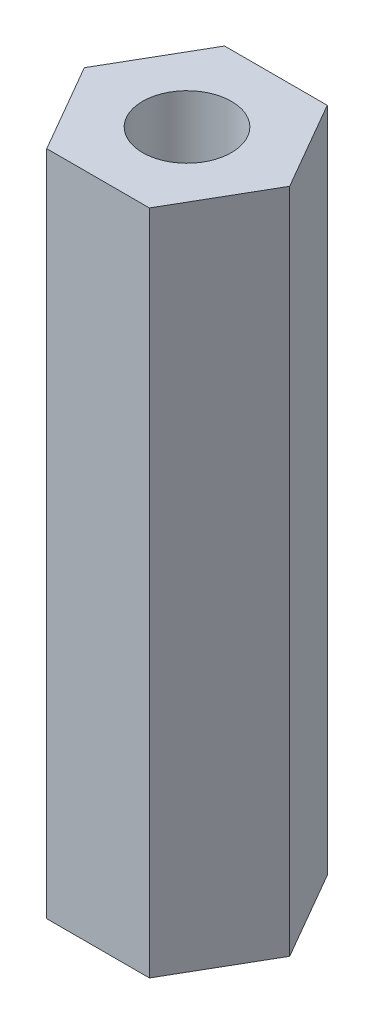
ISO-10303-21;
HEADER;
FILE_DESCRIPTION(('STEP AP214'),'2;1');
FILE_NAME('part.step','',(''),(''),'','','');
FILE_SCHEMA(('AUTOMOTIVE_DESIGN { 1 0 10303 214 1 1 1 1 }'));
ENDSEC;
DATA;
#1=APPLICATION_CONTEXT('core data for automotive mechanical design processes');
#2=APPLICATION_PROTOCOL_DEFINITION('international standard','automotive_design',2000,#1);
#3=PRODUCT_CONTEXT('',#1,'mechanical');
#4=PRODUCT('Part','Part','',(#3));
#5=PRODUCT_RELATED_PRODUCT_CATEGORY('part','',(#4));
#6=PRODUCT_DEFINITION_FORMATION('','',#4);
#7=PRODUCT_DEFINITION_CONTEXT('part definition',#1,'design');
#8=PRODUCT_DEFINITION('design','',#6,#7);
#9=PRODUCT_DEFINITION_SHAPE('','',#8);
#10=(LENGTH_UNIT() NAMED_UNIT(*) SI_UNIT(.MILLI.,.METRE.));
#11=(NAMED_UNIT(*) PLANE_ANGLE_UNIT() SI_UNIT($,.RADIAN.));
#12=(NAMED_UNIT(*) SI_UNIT($,.STERADIAN.) SOLID_ANGLE_UNIT());
#13=UNCERTAINTY_MEASURE_WITH_UNIT(LENGTH_MEASURE(1.E-05),#10,'distance_accuracy_value','');
#14=(GEOMETRIC_REPRESENTATION_CONTEXT(3) GLOBAL_UNCERTAINTY_ASSIGNED_CONTEXT((#13)) GLOBAL_UNIT_ASSIGNED_CONTEXT((#10,
#11,#12)) REPRESENTATION_CONTEXT('',''));
#15=CARTESIAN_POINT('',(0.,0.,0.));
#16=DIRECTION('',(0.,0.,1.));
#17=DIRECTION('',(1.,0.,0.));
#18=AXIS2_PLACEMENT_3D('',#15,#16,#17);
#19=CARTESIAN_POINT('',(0.,0.,0.));
#20=DIRECTION('',(0.,1.,0.));
#21=DIRECTION('',(1.,0.,0.));
#22=AXIS2_PLACEMENT_3D('',#19,#20,#21);
#23=CYLINDRICAL_SURFACE('',#22,1.);
#24=CARTESIAN_POINT('',(0.,0.,0.));
#25=DIRECTION('',(0.,-1.,0.));
#26=DIRECTION('',(1.,0.,0.));
#27=AXIS2_PLACEMENT_3D('',#24,#25,#26);
#28=CIRCLE('',#27,1.);
#29=CARTESIAN_POINT('',(-1.,0.,0.));
#30=VERTEX_POINT('',#29);
#31=EDGE_CURVE('E124',#30,#30,#28,.T.);
#32=ORIENTED_EDGE('',*,*,#31,.T.);
#33=DIRECTION('',(0.,1.,0.));
#34=VECTOR('',#33,1.);
#35=CARTESIAN_POINT('',(-1.,0.,0.));
#36=LINE('',#35,#34);
#37=CARTESIAN_POINT('',(-1.,15.,0.));
#38=VERTEX_POINT('',#37);
#39=EDGE_CURVE('E11',#30,#38,#36,.T.);
#40=ORIENTED_EDGE('',*,*,#39,.T.);
#41=CARTESIAN_POINT('',(0.,15.,0.));
#42=DIRECTION('',(0.,-1.,0.));
#43=DIRECTION('',(1.,0.,0.));
#44=AXIS2_PLACEMENT_3D('',#41,#42,#43);
#45=CIRCLE('',#44,1.);
#46=EDGE_CURVE('E121',#38,#38,#45,.T.);
#47=ORIENTED_EDGE('',*,*,#46,.F.);
#48=ORIENTED_EDGE('',*,*,#39,.F.);
#49=EDGE_LOOP('',(#32,#40,#47,#48));
#50=FACE_BOUND('',#49,.T.);
#51=ADVANCED_FACE('F17',(#50),#23,.F.);
#52=CARTESIAN_POINT('',(1.15470053837925,0.,-2.));
#53=DIRECTION('',(0.,0.,-1.));
#54=DIRECTION('',(-1.,0.,0.));
#55=AXIS2_PLACEMENT_3D('',#52,#53,#54);
#56=PLANE('',#55);
#57=DIRECTION('',(-1.,0.,0.));
#58=VECTOR('',#57,1.);
#59=CARTESIAN_POINT('',(1.15470053837925,0.,-2.));
#60=LINE('',#59,#58);
#61=CARTESIAN_POINT('',(1.15470053837925,0.,-2.));
#62=VERTEX_POINT('',#61);
#63=CARTESIAN_POINT('',(-1.15470053837925,0.,-2.));
#64=VERTEX_POINT('',#63);
#65=EDGE_CURVE('E135',#62,#64,#60,.T.);
#66=ORIENTED_EDGE('',*,*,#65,.T.);
#67=DIRECTION('',(0.,1.,0.));
#68=VECTOR('',#67,1.);
#69=CARTESIAN_POINT('',(-1.15470053837925,0.,-2.));
#70=LINE('',#69,#68);
#71=CARTESIAN_POINT('',(-1.15470053837925,15.,-2.));
#72=VERTEX_POINT('',#71);
#73=EDGE_CURVE('E130',#64,#72,#70,.T.);
#74=ORIENTED_EDGE('',*,*,#73,.T.);
#75=DIRECTION('',(-1.,0.,0.));
#76=VECTOR('',#75,1.);
#77=CARTESIAN_POINT('',(1.15470053837925,15.,-2.));
#78=LINE('',#77,#76);
#79=CARTESIAN_POINT('',(1.15470053837925,15.,-2.));
#80=VERTEX_POINT('',#79);
#81=EDGE_CURVE('E143',#80,#72,#78,.T.);
#82=ORIENTED_EDGE('',*,*,#81,.F.);
#83=DIRECTION('',(0.,1.,0.));
#84=VECTOR('',#83,1.);
#85=CARTESIAN_POINT('',(1.15470053837925,0.,-2.));
#86=LINE('',#85,#84);
#87=EDGE_CURVE('E28',#62,#80,#86,.T.);
#88=ORIENTED_EDGE('',*,*,#87,.F.);
#89=EDGE_LOOP('',(#66,#74,#82,#88));
#90=FACE_BOUND('',#89,.T.);
#91=ADVANCED_FACE('F171',(#90),#56,.T.);
#92=CARTESIAN_POINT('',(2.3094010767585,0.,0.));
#93=DIRECTION('',(0.866025403784438,0.,-0.5));
#94=DIRECTION('',(0.,-1.,0.));
#95=AXIS2_PLACEMENT_3D('',#92,#93,#94);
#96=PLANE('',#95);
#97=DIRECTION('',(-0.5,0.,-0.866025403784439));
#98=VECTOR('',#97,1.);
#99=CARTESIAN_POINT('',(2.3094010767585,0.,0.));
#100=LINE('',#99,#98);
#101=CARTESIAN_POINT('',(2.3094010767585,0.,0.));
#102=VERTEX_POINT('',#101);
#103=EDGE_CURVE('E138',#102,#62,#100,.T.);
#104=ORIENTED_EDGE('',*,*,#103,.T.);
#105=ORIENTED_EDGE('',*,*,#87,.T.);
#106=DIRECTION('',(-0.5,0.,-0.866025403784439));
#107=VECTOR('',#106,1.);
#108=CARTESIAN_POINT('',(2.3094010767585,15.,0.));
#109=LINE('',#108,#107);
#110=CARTESIAN_POINT('',(2.3094010767585,15.,0.));
#111=VERTEX_POINT('',#110);
#112=EDGE_CURVE('E110',#111,#80,#109,.T.);
#113=ORIENTED_EDGE('',*,*,#112,.F.);
#114=DIRECTION('',(0.,1.,0.));
#115=VECTOR('',#114,1.);
#116=CARTESIAN_POINT('',(2.3094010767585,0.,0.));
#117=LINE('',#116,#115);
#118=EDGE_CURVE('E85',#102,#111,#117,.T.);
#119=ORIENTED_EDGE('',*,*,#118,.F.);
#120=EDGE_LOOP('',(#104,#105,#113,#119));
#121=FACE_BOUND('',#120,.T.);
#122=ADVANCED_FACE('F164',(#121),#96,.T.);
#123=CARTESIAN_POINT('',(1.15470053837925,0.,2.));
#124=DIRECTION('',(0.866025403784439,0.,0.5));
#125=DIRECTION('',(0.,-1.,0.));
#126=AXIS2_PLACEMENT_3D('',#123,#124,#125);
#127=PLANE('',#126);
#128=DIRECTION('',(0.5,0.,-0.866025403784439));
#129=VECTOR('',#128,1.);
#130=CARTESIAN_POINT('',(1.15470053837925,0.,2.));
#131=LINE('',#130,#129);
#132=CARTESIAN_POINT('',(1.15470053837925,0.,2.));
#133=VERTEX_POINT('',#132);
#134=EDGE_CURVE('E149',#133,#102,#131,.T.);
#135=ORIENTED_EDGE('',*,*,#134,.T.);
#136=ORIENTED_EDGE('',*,*,#118,.T.);
#137=DIRECTION('',(0.5,0.,-0.866025403784439));
#138=VECTOR('',#137,1.);
#139=CARTESIAN_POINT('',(1.15470053837925,15.,2.));
#140=LINE('',#139,#138);
#141=CARTESIAN_POINT('',(1.15470053837925,15.,2.));
#142=VERTEX_POINT('',#141);
#143=EDGE_CURVE('E105',#142,#111,#140,.T.);
#144=ORIENTED_EDGE('',*,*,#143,.F.);
#145=DIRECTION('',(0.,1.,0.));
#146=VECTOR('',#145,1.);
#147=CARTESIAN_POINT('',(1.15470053837925,0.,2.));
#148=LINE('',#147,#146);
#149=EDGE_CURVE('E93',#133,#142,#148,.T.);
#150=ORIENTED_EDGE('',*,*,#149,.F.);
#151=EDGE_LOOP('',(#135,#136,#144,#150));
#152=FACE_BOUND('',#151,.T.);
#153=ADVANCED_FACE('F106',(#152),#127,.T.);
#154=CARTESIAN_POINT('',(-1.15470053837925,0.,2.));
#155=DIRECTION('',(0.,0.,1.));
#156=DIRECTION('',(1.,0.,0.));
#157=AXIS2_PLACEMENT_3D('',#154,#155,#156);
#158=PLANE('',#157);
#159=DIRECTION('',(1.,0.,0.));
#160=VECTOR('',#159,1.);
#161=CARTESIAN_POINT('',(-1.15470053837925,0.,2.));
#162=LINE('',#161,#160);
#163=CARTESIAN_POINT('',(-1.15470053837925,0.,2.));
#164=VERTEX_POINT('',#163);
#165=EDGE_CURVE('E99',#164,#133,#162,.T.);
#166=ORIENTED_EDGE('',*,*,#165,.T.);
#167=ORIENTED_EDGE('',*,*,#149,.T.);
#168=DIRECTION('',(1.,0.,0.));
#169=VECTOR('',#168,1.);
#170=CARTESIAN_POINT('',(-1.15470053837925,15.,2.));
#171=LINE('',#170,#169);
#172=CARTESIAN_POINT('',(-1.15470053837925,15.,2.));
#173=VERTEX_POINT('',#172);
#174=EDGE_CURVE('E96',#173,#142,#171,.T.);
#175=ORIENTED_EDGE('',*,*,#174,.F.);
#176=DIRECTION('',(0.,1.,0.));
#177=VECTOR('',#176,1.);
#178=CARTESIAN_POINT('',(-1.15470053837925,0.,2.));
#179=LINE('',#178,#177);
#180=EDGE_CURVE('E102',#164,#173,#179,.T.);
#181=ORIENTED_EDGE('',*,*,#180,.F.);
#182=EDGE_LOOP('',(#166,#167,#175,#181));
#183=FACE_BOUND('',#182,.T.);
#184=ADVANCED_FACE('F94',(#183),#158,.T.);
#185=CARTESIAN_POINT('',(-2.30940107675851,0.,0.));
#186=DIRECTION('',(-0.866025403784439,0.,0.5));
#187=DIRECTION('',(0.,1.,0.));
#188=AXIS2_PLACEMENT_3D('',#185,#186,#187);
#189=PLANE('',#188);
#190=DIRECTION('',(0.5,0.,0.866025403784439));
#191=VECTOR('',#190,1.);
#192=CARTESIAN_POINT('',(-2.30940107675851,0.,0.));
#193=LINE('',#192,#191);
#194=CARTESIAN_POINT('',(-2.30940107675851,0.,0.));
#195=VERTEX_POINT('',#194);
#196=EDGE_CURVE('E127',#195,#164,#193,.T.);
#197=ORIENTED_EDGE('',*,*,#196,.T.);
#198=ORIENTED_EDGE('',*,*,#180,.T.);
#199=DIRECTION('',(0.5,0.,0.866025403784439));
#200=VECTOR('',#199,1.);
#201=CARTESIAN_POINT('',(-2.30940107675851,15.,0.));
#202=LINE('',#201,#200);
#203=CARTESIAN_POINT('',(-2.30940107675851,15.,0.));
#204=VERTEX_POINT('',#203);
#205=EDGE_CURVE('E21',#204,#173,#202,.T.);
#206=ORIENTED_EDGE('',*,*,#205,.F.);
#207=DIRECTION('',(0.,1.,0.));
#208=VECTOR('',#207,1.);
#209=CARTESIAN_POINT('',(-2.30940107675851,0.,0.));
#210=LINE('',#209,#208);
#211=EDGE_CURVE('E131',#195,#204,#210,.T.);
#212=ORIENTED_EDGE('',*,*,#211,.F.);
#213=EDGE_LOOP('',(#197,#198,#206,#212));
#214=FACE_BOUND('',#213,.T.);
#215=ADVANCED_FACE('F186',(#214),#189,.T.);
#216=CARTESIAN_POINT('',(-1.15470053837925,0.,-2.));
#217=DIRECTION('',(-0.866025403784439,0.,-0.5));
#218=DIRECTION('',(-0.5,0.,0.866025403784439));
#219=AXIS2_PLACEMENT_3D('',#216,#217,#218);
#220=PLANE('',#219);
#221=DIRECTION('',(-0.5,0.,0.866025403784439));
#222=VECTOR('',#221,1.);
#223=CARTESIAN_POINT('',(-1.15470053837925,0.,-2.));
#224=LINE('',#223,#222);
#225=EDGE_CURVE('E139',#64,#195,#224,.T.);
#226=ORIENTED_EDGE('',*,*,#225,.T.);
#227=ORIENTED_EDGE('',*,*,#211,.T.);
#228=DIRECTION('',(-0.5,0.,0.866025403784439));
#229=VECTOR('',#228,1.);
#230=CARTESIAN_POINT('',(-1.15470053837925,15.,-2.));
#231=LINE('',#230,#229);
#232=EDGE_CURVE('E119',#72,#204,#231,.T.);
#233=ORIENTED_EDGE('',*,*,#232,.F.);
#234=ORIENTED_EDGE('',*,*,#73,.F.);
#235=EDGE_LOOP('',(#226,#227,#233,#234));
#236=FACE_BOUND('',#235,.T.);
#237=ADVANCED_FACE('F190',(#236),#220,.T.);
#238=CARTESIAN_POINT('',(0.,15.,0.));
#239=DIRECTION('',(0.,1.,0.));
#240=DIRECTION('',(1.,0.,0.));
#241=AXIS2_PLACEMENT_3D('',#238,#239,#240);
#242=PLANE('',#241);
#243=ORIENTED_EDGE('',*,*,#46,.T.);
#244=EDGE_LOOP('',(#243));
#245=FACE_BOUND('',#244,.T.);
#246=ORIENTED_EDGE('',*,*,#232,.T.);
#247=ORIENTED_EDGE('',*,*,#205,.T.);
#248=ORIENTED_EDGE('',*,*,#174,.T.);
#249=ORIENTED_EDGE('',*,*,#143,.T.);
#250=ORIENTED_EDGE('',*,*,#112,.T.);
#251=ORIENTED_EDGE('',*,*,#81,.T.);
#252=EDGE_LOOP('',(#246,#247,#248,#249,#250,#251));
#253=FACE_BOUND('',#252,.T.);
#254=ADVANCED_FACE('F19',(#245,#253),#242,.T.);
#255=CARTESIAN_POINT('',(0.,0.,0.));
#256=DIRECTION('',(0.,1.,0.));
#257=DIRECTION('',(1.,0.,0.));
#258=AXIS2_PLACEMENT_3D('',#255,#256,#257);
#259=PLANE('',#258);
#260=ORIENTED_EDGE('',*,*,#31,.F.);
#261=EDGE_LOOP('',(#260));
#262=FACE_BOUND('',#261,.T.);
#263=ORIENTED_EDGE('',*,*,#225,.F.);
#264=ORIENTED_EDGE('',*,*,#65,.F.);
#265=ORIENTED_EDGE('',*,*,#103,.F.);
#266=ORIENTED_EDGE('',*,*,#134,.F.);
#267=ORIENTED_EDGE('',*,*,#165,.F.);
#268=ORIENTED_EDGE('',*,*,#196,.F.);
#269=EDGE_LOOP('',(#263,#264,#265,#266,#267,#268));
#270=FACE_BOUND('',#269,.T.);
#271=ADVANCED_FACE('F168',(#262,#270),#259,.F.);
#272=CLOSED_SHELL('',(#51,#91,#122,#153,#184,#215,#237,#254,#271));
#273=MANIFOLD_SOLID_BREP('B1',#272);
#274=ADVANCED_BREP_SHAPE_REPRESENTATION('',(#18,#273),#14);
#275=SHAPE_DEFINITION_REPRESENTATION(#9,#274);
ENDSEC;
END-ISO-10303-21;
